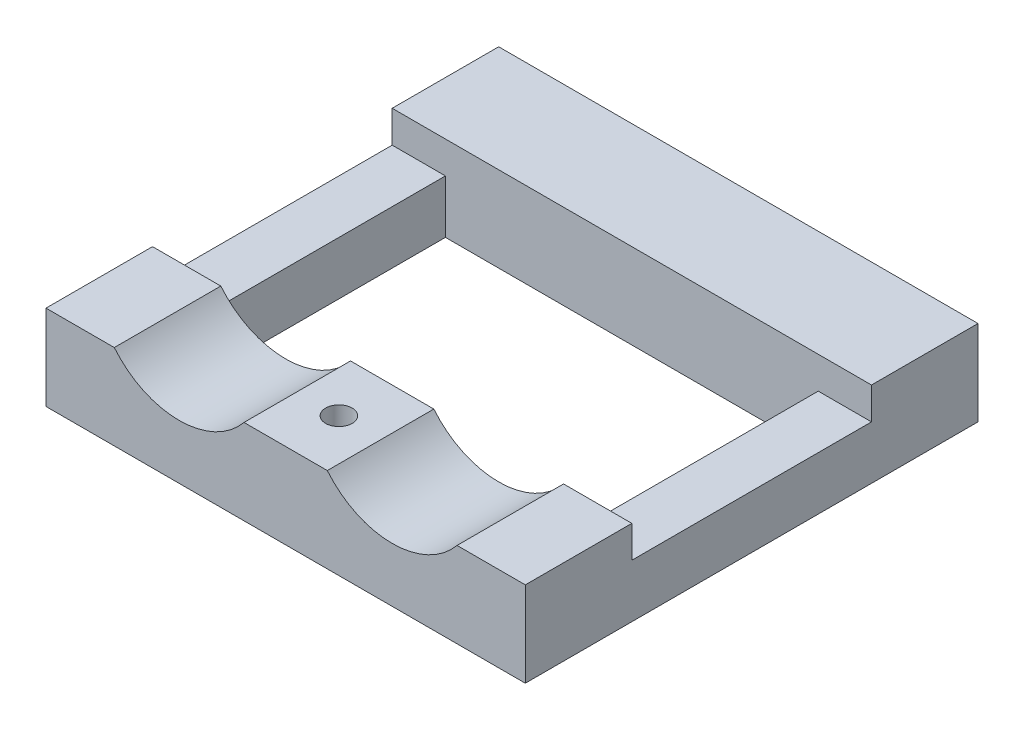
ISO-10303-21;
HEADER;
FILE_DESCRIPTION(('STEP AP214'),'2;1');
FILE_NAME('part.step','',(''),(''),'','','');
FILE_SCHEMA(('AUTOMOTIVE_DESIGN { 1 0 10303 214 1 1 1 1 }'));
ENDSEC;
DATA;
#1=APPLICATION_CONTEXT('core data for automotive mechanical design processes');
#2=APPLICATION_PROTOCOL_DEFINITION('international standard','automotive_design',2000,#1);
#3=PRODUCT_CONTEXT('',#1,'mechanical');
#4=PRODUCT('Part','Part','',(#3));
#5=PRODUCT_RELATED_PRODUCT_CATEGORY('part','',(#4));
#6=PRODUCT_DEFINITION_FORMATION('','',#4);
#7=PRODUCT_DEFINITION_CONTEXT('part definition',#1,'design');
#8=PRODUCT_DEFINITION('design','',#6,#7);
#9=PRODUCT_DEFINITION_SHAPE('','',#8);
#10=(LENGTH_UNIT() NAMED_UNIT(*) SI_UNIT(.MILLI.,.METRE.));
#11=(NAMED_UNIT(*) PLANE_ANGLE_UNIT() SI_UNIT($,.RADIAN.));
#12=(NAMED_UNIT(*) SI_UNIT($,.STERADIAN.) SOLID_ANGLE_UNIT());
#13=UNCERTAINTY_MEASURE_WITH_UNIT(LENGTH_MEASURE(1.E-05),#10,'distance_accuracy_value','');
#14=(GEOMETRIC_REPRESENTATION_CONTEXT(3) GLOBAL_UNCERTAINTY_ASSIGNED_CONTEXT((#13)) GLOBAL_UNIT_ASSIGNED_CONTEXT((#10,
#11,#12)) REPRESENTATION_CONTEXT('',''));
#15=CARTESIAN_POINT('',(0.,0.,0.));
#16=DIRECTION('',(0.,0.,1.));
#17=DIRECTION('',(1.,0.,0.));
#18=AXIS2_PLACEMENT_3D('',#15,#16,#17);
#19=CARTESIAN_POINT('',(0.,0.,0.));
#20=DIRECTION('',(0.,0.,-1.));
#21=DIRECTION('',(-1.,0.,0.));
#22=AXIS2_PLACEMENT_3D('',#19,#20,#21);
#23=PLANE('',#22);
#24=DIRECTION('',(0.,-1.,0.));
#25=VECTOR('',#24,1.);
#26=CARTESIAN_POINT('',(6.35,6.35,0.));
#27=LINE('',#26,#25);
#28=CARTESIAN_POINT('',(6.35,6.35,0.));
#29=VERTEX_POINT('',#28);
#30=CARTESIAN_POINT('',(6.35,0.,0.));
#31=VERTEX_POINT('',#30);
#32=EDGE_CURVE('E194',#29,#31,#27,.T.);
#33=ORIENTED_EDGE('',*,*,#32,.F.);
#34=DIRECTION('',(1.,0.,0.));
#35=VECTOR('',#34,1.);
#36=CARTESIAN_POINT('',(0.,6.35,0.));
#37=LINE('',#36,#35);
#38=CARTESIAN_POINT('',(0.,6.35,0.));
#39=VERTEX_POINT('',#38);
#40=EDGE_CURVE('E189',#39,#29,#37,.T.);
#41=ORIENTED_EDGE('',*,*,#40,.F.);
#42=DIRECTION('',(0.,-1.,0.));
#43=VECTOR('',#42,1.);
#44=CARTESIAN_POINT('',(0.,0.,0.));
#45=LINE('',#44,#43);
#46=CARTESIAN_POINT('',(0.,10.16,0.));
#47=VERTEX_POINT('',#46);
#48=EDGE_CURVE('E254',#47,#39,#45,.T.);
#49=ORIENTED_EDGE('',*,*,#48,.F.);
#50=DIRECTION('',(-1.,0.,0.));
#51=VECTOR('',#50,1.);
#52=CARTESIAN_POINT('',(0.,10.16,0.));
#53=LINE('',#52,#51);
#54=CARTESIAN_POINT('',(8.14166954023042,10.16,0.));
#55=VERTEX_POINT('',#54);
#56=EDGE_CURVE('E273',#55,#47,#53,.T.);
#57=ORIENTED_EDGE('',*,*,#56,.F.);
#58=CARTESIAN_POINT('',(15.875,16.5,0.));
#59=DIRECTION('',(0.,0.,1.));
#60=DIRECTION('',(1.,0.,0.));
#61=AXIS2_PLACEMENT_3D('',#58,#59,#60);
#62=CIRCLE('',#61,10.);
#63=CARTESIAN_POINT('',(23.6083304597696,10.16,0.));
#64=VERTEX_POINT('',#63);
#65=EDGE_CURVE('E243',#55,#64,#62,.T.);
#66=ORIENTED_EDGE('',*,*,#65,.T.);
#67=CARTESIAN_POINT('',(33.5416695402304,10.16,0.));
#68=VERTEX_POINT('',#67);
#69=EDGE_CURVE('E276',#68,#64,#53,.T.);
#70=ORIENTED_EDGE('',*,*,#69,.F.);
#71=CARTESIAN_POINT('',(41.275,16.5,0.));
#72=DIRECTION('',(0.,0.,1.));
#73=DIRECTION('',(1.,0.,0.));
#74=AXIS2_PLACEMENT_3D('',#71,#72,#73);
#75=CIRCLE('',#74,10.);
#76=CARTESIAN_POINT('',(49.0083304597696,10.16,0.));
#77=VERTEX_POINT('',#76);
#78=EDGE_CURVE('E232',#68,#77,#75,.T.);
#79=ORIENTED_EDGE('',*,*,#78,.T.);
#80=CARTESIAN_POINT('',(57.15,10.16,0.));
#81=VERTEX_POINT('',#80);
#82=EDGE_CURVE('E259',#81,#77,#53,.T.);
#83=ORIENTED_EDGE('',*,*,#82,.F.);
#84=DIRECTION('',(0.,1.,0.));
#85=VECTOR('',#84,1.);
#86=CARTESIAN_POINT('',(57.15,0.,0.));
#87=LINE('',#86,#85);
#88=CARTESIAN_POINT('',(57.15,6.35,0.));
#89=VERTEX_POINT('',#88);
#90=EDGE_CURVE('E271',#89,#81,#87,.T.);
#91=ORIENTED_EDGE('',*,*,#90,.F.);
#92=DIRECTION('',(1.,0.,0.));
#93=VECTOR('',#92,1.);
#94=CARTESIAN_POINT('',(57.15,6.35,0.));
#95=LINE('',#94,#93);
#96=CARTESIAN_POINT('',(50.8,6.35,0.));
#97=VERTEX_POINT('',#96);
#98=EDGE_CURVE('E209',#97,#89,#95,.T.);
#99=ORIENTED_EDGE('',*,*,#98,.F.);
#100=DIRECTION('',(0.,1.,0.));
#101=VECTOR('',#100,1.);
#102=CARTESIAN_POINT('',(50.8,6.35,0.));
#103=LINE('',#102,#101);
#104=CARTESIAN_POINT('',(50.8,0.,0.));
#105=VERTEX_POINT('',#104);
#106=EDGE_CURVE('E204',#105,#97,#103,.T.);
#107=ORIENTED_EDGE('',*,*,#106,.F.);
#108=DIRECTION('',(1.,0.,0.));
#109=VECTOR('',#108,1.);
#110=CARTESIAN_POINT('',(0.,0.,0.));
#111=LINE('',#110,#109);
#112=EDGE_CURVE('E58',#31,#105,#111,.T.);
#113=ORIENTED_EDGE('',*,*,#112,.F.);
#114=EDGE_LOOP('',(#33,#41,#49,#57,#66,#70,#79,#83,#91,#99,#107,#113));
#115=FACE_BOUND('',#114,.T.);
#116=ADVANCED_FACE('F35',(#115),#23,.T.);
#117=CARTESIAN_POINT('',(0.,10.16,12.7));
#118=DIRECTION('',(0.,-1.,0.));
#119=DIRECTION('',(0.,0.,-1.));
#120=AXIS2_PLACEMENT_3D('',#117,#118,#119);
#121=PLANE('',#120);
#122=ORIENTED_EDGE('',*,*,#82,.T.);
#123=DIRECTION('',(0.,0.,1.));
#124=VECTOR('',#123,1.);
#125=CARTESIAN_POINT('',(49.0083304597696,10.16,0.));
#126=LINE('',#125,#124);
#127=CARTESIAN_POINT('',(49.0083304597696,10.16,12.7));
#128=VERTEX_POINT('',#127);
#129=EDGE_CURVE('E239',#77,#128,#126,.T.);
#130=ORIENTED_EDGE('',*,*,#129,.T.);
#131=DIRECTION('',(-1.,0.,0.));
#132=VECTOR('',#131,1.);
#133=CARTESIAN_POINT('',(0.,10.16,12.7));
#134=LINE('',#133,#132);
#135=CARTESIAN_POINT('',(57.15,10.16,12.7));
#136=VERTEX_POINT('',#135);
#137=EDGE_CURVE('E263',#136,#128,#134,.T.);
#138=ORIENTED_EDGE('',*,*,#137,.F.);
#139=DIRECTION('',(0.,0.,-1.));
#140=VECTOR('',#139,1.);
#141=CARTESIAN_POINT('',(57.15,10.16,12.7));
#142=LINE('',#141,#140);
#143=EDGE_CURVE('E157',#136,#81,#142,.T.);
#144=ORIENTED_EDGE('',*,*,#143,.T.);
#145=EDGE_LOOP('',(#122,#130,#138,#144));
#146=FACE_BOUND('',#145,.T.);
#147=ADVANCED_FACE('F283',(#146),#121,.F.);
#148=CARTESIAN_POINT('',(28.575,10.16,6.35));
#149=DIRECTION('',(0.,1.,0.));
#150=DIRECTION('',(0.,0.,1.));
#151=AXIS2_PLACEMENT_3D('',#148,#149,#150);
#152=CIRCLE('',#151,1.5875);
#153=CARTESIAN_POINT('',(28.575,10.16,7.9375));
#154=VERTEX_POINT('',#153);
#155=EDGE_CURVE('E225',#154,#154,#152,.T.);
#156=ORIENTED_EDGE('',*,*,#155,.F.);
#157=EDGE_LOOP('',(#156));
#158=FACE_BOUND('',#157,.T.);
#159=CARTESIAN_POINT('',(33.5416695402304,10.16,12.7));
#160=VERTEX_POINT('',#159);
#161=CARTESIAN_POINT('',(23.6083304597696,10.16,12.7));
#162=VERTEX_POINT('',#161);
#163=EDGE_CURVE('E267',#160,#162,#134,.T.);
#164=ORIENTED_EDGE('',*,*,#163,.F.);
#165=DIRECTION('',(0.,0.,1.));
#166=VECTOR('',#165,1.);
#167=CARTESIAN_POINT('',(33.5416695402304,10.16,0.));
#168=LINE('',#167,#166);
#169=EDGE_CURVE('E235',#160,#68,#168,.F.);
#170=ORIENTED_EDGE('',*,*,#169,.T.);
#171=ORIENTED_EDGE('',*,*,#69,.T.);
#172=DIRECTION('',(0.,0.,1.));
#173=VECTOR('',#172,1.);
#174=CARTESIAN_POINT('',(23.6083304597696,10.16,0.));
#175=LINE('',#174,#173);
#176=EDGE_CURVE('E251',#64,#162,#175,.T.);
#177=ORIENTED_EDGE('',*,*,#176,.T.);
#178=EDGE_LOOP('',(#164,#170,#171,#177));
#179=FACE_BOUND('',#178,.T.);
#180=ADVANCED_FACE('F292',(#158,#179),#121,.F.);
#181=CARTESIAN_POINT('',(0.,0.,12.7));
#182=DIRECTION('',(1.,0.,0.));
#183=DIRECTION('',(0.,0.,-1.));
#184=AXIS2_PLACEMENT_3D('',#181,#182,#183);
#185=PLANE('',#184);
#186=ORIENTED_EDGE('',*,*,#48,.T.);
#187=DIRECTION('',(0.,0.,1.));
#188=VECTOR('',#187,1.);
#189=CARTESIAN_POINT('',(0.,6.35,-28.575));
#190=LINE('',#189,#188);
#191=CARTESIAN_POINT('',(0.,6.35,-28.575));
#192=VERTEX_POINT('',#191);
#193=EDGE_CURVE('E202',#192,#39,#190,.T.);
#194=ORIENTED_EDGE('',*,*,#193,.F.);
#195=DIRECTION('',(0.,1.,0.));
#196=VECTOR('',#195,1.);
#197=CARTESIAN_POINT('',(0.,0.,-28.575));
#198=LINE('',#197,#196);
#199=CARTESIAN_POINT('',(0.,10.16,-28.575));
#200=VERTEX_POINT('',#199);
#201=EDGE_CURVE('E172',#192,#200,#198,.T.);
#202=ORIENTED_EDGE('',*,*,#201,.T.);
#203=DIRECTION('',(0.,0.,1.));
#204=VECTOR('',#203,1.);
#205=CARTESIAN_POINT('',(0.,10.16,-41.275));
#206=LINE('',#205,#204);
#207=CARTESIAN_POINT('',(0.,10.16,-41.275));
#208=VERTEX_POINT('',#207);
#209=EDGE_CURVE('E186',#208,#200,#206,.T.);
#210=ORIENTED_EDGE('',*,*,#209,.F.);
#211=DIRECTION('',(0.,1.,0.));
#212=VECTOR('',#211,1.);
#213=CARTESIAN_POINT('',(0.,0.,-41.275));
#214=LINE('',#213,#212);
#215=CARTESIAN_POINT('',(0.,0.,-41.275));
#216=VERTEX_POINT('',#215);
#217=EDGE_CURVE('E164',#216,#208,#214,.T.);
#218=ORIENTED_EDGE('',*,*,#217,.F.);
#219=DIRECTION('',(0.,0.,-1.));
#220=VECTOR('',#219,1.);
#221=CARTESIAN_POINT('',(0.,0.,12.7));
#222=LINE('',#221,#220);
#223=CARTESIAN_POINT('',(0.,0.,12.7));
#224=VERTEX_POINT('',#223);
#225=EDGE_CURVE('E11',#224,#216,#222,.T.);
#226=ORIENTED_EDGE('',*,*,#225,.F.);
#227=DIRECTION('',(0.,-1.,0.));
#228=VECTOR('',#227,1.);
#229=CARTESIAN_POINT('',(0.,0.,12.7));
#230=LINE('',#229,#228);
#231=CARTESIAN_POINT('',(0.,10.16,12.7));
#232=VERTEX_POINT('',#231);
#233=EDGE_CURVE('E255',#232,#224,#230,.T.);
#234=ORIENTED_EDGE('',*,*,#233,.F.);
#235=DIRECTION('',(0.,0.,-1.));
#236=VECTOR('',#235,1.);
#237=CARTESIAN_POINT('',(0.,10.16,12.7));
#238=LINE('',#237,#236);
#239=EDGE_CURVE('E266',#232,#47,#238,.T.);
#240=ORIENTED_EDGE('',*,*,#239,.T.);
#241=EDGE_LOOP('',(#186,#194,#202,#210,#218,#226,#234,#240));
#242=FACE_BOUND('',#241,.T.);
#243=ADVANCED_FACE('F37',(#242),#185,.F.);
#244=CARTESIAN_POINT('',(0.,0.,12.7));
#245=DIRECTION('',(0.,1.,0.));
#246=DIRECTION('',(0.,0.,1.));
#247=AXIS2_PLACEMENT_3D('',#244,#245,#246);
#248=PLANE('',#247);
#249=DIRECTION('',(0.,0.,1.));
#250=VECTOR('',#249,1.);
#251=CARTESIAN_POINT('',(50.8,0.,-28.575));
#252=LINE('',#251,#250);
#253=CARTESIAN_POINT('',(50.8,0.,-28.575));
#254=VERTEX_POINT('',#253);
#255=EDGE_CURVE('E222',#254,#105,#252,.T.);
#256=ORIENTED_EDGE('',*,*,#255,.F.);
#257=DIRECTION('',(-1.,0.,0.));
#258=VECTOR('',#257,1.);
#259=CARTESIAN_POINT('',(57.15,0.,-28.575));
#260=LINE('',#259,#258);
#261=CARTESIAN_POINT('',(6.35,0.,-28.575));
#262=VERTEX_POINT('',#261);
#263=EDGE_CURVE('E181',#254,#262,#260,.T.);
#264=ORIENTED_EDGE('',*,*,#263,.T.);
#265=DIRECTION('',(0.,0.,1.));
#266=VECTOR('',#265,1.);
#267=CARTESIAN_POINT('',(6.35,0.,-28.575));
#268=LINE('',#267,#266);
#269=EDGE_CURVE('E197',#262,#31,#268,.T.);
#270=ORIENTED_EDGE('',*,*,#269,.T.);
#271=ORIENTED_EDGE('',*,*,#112,.T.);
#272=EDGE_LOOP('',(#256,#264,#270,#271));
#273=FACE_BOUND('',#272,.T.);
#274=CARTESIAN_POINT('',(28.575,0.,6.35));
#275=DIRECTION('',(0.,1.,0.));
#276=DIRECTION('',(0.,0.,1.));
#277=AXIS2_PLACEMENT_3D('',#274,#275,#276);
#278=CIRCLE('',#277,1.5875);
#279=CARTESIAN_POINT('',(28.575,0.,7.9375));
#280=VERTEX_POINT('',#279);
#281=EDGE_CURVE('E226',#280,#280,#278,.T.);
#282=ORIENTED_EDGE('',*,*,#281,.T.);
#283=EDGE_LOOP('',(#282));
#284=FACE_BOUND('',#283,.T.);
#285=ORIENTED_EDGE('',*,*,#225,.T.);
#286=DIRECTION('',(-1.,0.,0.));
#287=VECTOR('',#286,1.);
#288=CARTESIAN_POINT('',(57.15,0.,-41.275));
#289=LINE('',#288,#287);
#290=CARTESIAN_POINT('',(57.15,0.,-41.275));
#291=VERTEX_POINT('',#290);
#292=EDGE_CURVE('E159',#291,#216,#289,.T.);
#293=ORIENTED_EDGE('',*,*,#292,.F.);
#294=DIRECTION('',(0.,0.,-1.));
#295=VECTOR('',#294,1.);
#296=CARTESIAN_POINT('',(57.15,0.,12.7));
#297=LINE('',#296,#295);
#298=CARTESIAN_POINT('',(57.15,0.,12.7));
#299=VERTEX_POINT('',#298);
#300=EDGE_CURVE('E43',#299,#291,#297,.T.);
#301=ORIENTED_EDGE('',*,*,#300,.F.);
#302=DIRECTION('',(1.,0.,0.));
#303=VECTOR('',#302,1.);
#304=CARTESIAN_POINT('',(0.,0.,12.7));
#305=LINE('',#304,#303);
#306=EDGE_CURVE('E258',#224,#299,#305,.T.);
#307=ORIENTED_EDGE('',*,*,#306,.F.);
#308=EDGE_LOOP('',(#285,#293,#301,#307));
#309=FACE_BOUND('',#308,.T.);
#310=ADVANCED_FACE('F160',(#273,#284,#309),#248,.F.);
#311=CARTESIAN_POINT('',(57.15,0.,12.7));
#312=DIRECTION('',(-1.,0.,0.));
#313=DIRECTION('',(0.,0.,1.));
#314=AXIS2_PLACEMENT_3D('',#311,#312,#313);
#315=PLANE('',#314);
#316=ORIENTED_EDGE('',*,*,#300,.T.);
#317=DIRECTION('',(0.,-1.,0.));
#318=VECTOR('',#317,1.);
#319=CARTESIAN_POINT('',(57.15,0.,-41.275));
#320=LINE('',#319,#318);
#321=CARTESIAN_POINT('',(57.15,10.16,-41.275));
#322=VERTEX_POINT('',#321);
#323=EDGE_CURVE('E153',#322,#291,#320,.T.);
#324=ORIENTED_EDGE('',*,*,#323,.F.);
#325=DIRECTION('',(0.,0.,1.));
#326=VECTOR('',#325,1.);
#327=CARTESIAN_POINT('',(57.15,10.16,-41.275));
#328=LINE('',#327,#326);
#329=CARTESIAN_POINT('',(57.15,10.16,-28.575));
#330=VERTEX_POINT('',#329);
#331=EDGE_CURVE('E177',#322,#330,#328,.T.);
#332=ORIENTED_EDGE('',*,*,#331,.T.);
#333=DIRECTION('',(0.,-1.,0.));
#334=VECTOR('',#333,1.);
#335=CARTESIAN_POINT('',(57.15,0.,-28.575));
#336=LINE('',#335,#334);
#337=CARTESIAN_POINT('',(57.15,6.35,-28.575));
#338=VERTEX_POINT('',#337);
#339=EDGE_CURVE('E178',#330,#338,#336,.T.);
#340=ORIENTED_EDGE('',*,*,#339,.T.);
#341=DIRECTION('',(0.,0.,1.));
#342=VECTOR('',#341,1.);
#343=CARTESIAN_POINT('',(57.15,6.35,-28.575));
#344=LINE('',#343,#342);
#345=EDGE_CURVE('E212',#338,#89,#344,.T.);
#346=ORIENTED_EDGE('',*,*,#345,.T.);
#347=ORIENTED_EDGE('',*,*,#90,.T.);
#348=ORIENTED_EDGE('',*,*,#143,.F.);
#349=DIRECTION('',(0.,1.,0.));
#350=VECTOR('',#349,1.);
#351=CARTESIAN_POINT('',(57.15,0.,12.7));
#352=LINE('',#351,#350);
#353=EDGE_CURVE('E155',#299,#136,#352,.T.);
#354=ORIENTED_EDGE('',*,*,#353,.F.);
#355=EDGE_LOOP('',(#316,#324,#332,#340,#346,#347,#348,#354));
#356=FACE_BOUND('',#355,.T.);
#357=ADVANCED_FACE('F150',(#356),#315,.F.);
#358=CARTESIAN_POINT('',(8.14166954023042,10.16,12.7));
#359=VERTEX_POINT('',#358);
#360=EDGE_CURVE('E262',#359,#232,#134,.T.);
#361=ORIENTED_EDGE('',*,*,#360,.F.);
#362=DIRECTION('',(0.,0.,1.));
#363=VECTOR('',#362,1.);
#364=CARTESIAN_POINT('',(8.14166954023042,10.16,0.));
#365=LINE('',#364,#363);
#366=EDGE_CURVE('E246',#359,#55,#365,.F.);
#367=ORIENTED_EDGE('',*,*,#366,.T.);
#368=ORIENTED_EDGE('',*,*,#56,.T.);
#369=ORIENTED_EDGE('',*,*,#239,.F.);
#370=EDGE_LOOP('',(#361,#367,#368,#369));
#371=FACE_BOUND('',#370,.T.);
#372=ADVANCED_FACE('F301',(#371),#121,.F.);
#373=CARTESIAN_POINT('',(0.,0.,12.7));
#374=DIRECTION('',(0.,0.,-1.));
#375=DIRECTION('',(-1.,0.,0.));
#376=AXIS2_PLACEMENT_3D('',#373,#374,#375);
#377=PLANE('',#376);
#378=ORIENTED_EDGE('',*,*,#137,.T.);
#379=CARTESIAN_POINT('',(41.275,16.5,12.7));
#380=DIRECTION('',(0.,0.,1.));
#381=DIRECTION('',(1.,0.,0.));
#382=AXIS2_PLACEMENT_3D('',#379,#380,#381);
#383=CIRCLE('',#382,10.);
#384=EDGE_CURVE('E229',#160,#128,#383,.T.);
#385=ORIENTED_EDGE('',*,*,#384,.F.);
#386=ORIENTED_EDGE('',*,*,#163,.T.);
#387=CARTESIAN_POINT('',(15.875,16.5,12.7));
#388=DIRECTION('',(0.,0.,1.));
#389=DIRECTION('',(1.,0.,0.));
#390=AXIS2_PLACEMENT_3D('',#387,#388,#389);
#391=CIRCLE('',#390,10.);
#392=EDGE_CURVE('E242',#359,#162,#391,.T.);
#393=ORIENTED_EDGE('',*,*,#392,.F.);
#394=ORIENTED_EDGE('',*,*,#360,.T.);
#395=ORIENTED_EDGE('',*,*,#233,.T.);
#396=ORIENTED_EDGE('',*,*,#306,.T.);
#397=ORIENTED_EDGE('',*,*,#353,.T.);
#398=EDGE_LOOP('',(#378,#385,#386,#393,#394,#395,#396,#397));
#399=FACE_BOUND('',#398,.T.);
#400=ADVANCED_FACE('F298',(#399),#377,.F.);
#401=CARTESIAN_POINT('',(15.875,16.5,0.));
#402=DIRECTION('',(0.,0.,1.));
#403=DIRECTION('',(1.,0.,0.));
#404=AXIS2_PLACEMENT_3D('',#401,#402,#403);
#405=CYLINDRICAL_SURFACE('',#404,10.);
#406=ORIENTED_EDGE('',*,*,#65,.F.);
#407=ORIENTED_EDGE('',*,*,#366,.F.);
#408=ORIENTED_EDGE('',*,*,#392,.T.);
#409=ORIENTED_EDGE('',*,*,#176,.F.);
#410=EDGE_LOOP('',(#406,#407,#408,#409));
#411=FACE_BOUND('',#410,.T.);
#412=ADVANCED_FACE('F366',(#411),#405,.F.);
#413=CARTESIAN_POINT('',(41.275,16.5,0.));
#414=DIRECTION('',(0.,0.,1.));
#415=DIRECTION('',(1.,0.,0.));
#416=AXIS2_PLACEMENT_3D('',#413,#414,#415);
#417=CYLINDRICAL_SURFACE('',#416,10.);
#418=ORIENTED_EDGE('',*,*,#78,.F.);
#419=ORIENTED_EDGE('',*,*,#169,.F.);
#420=ORIENTED_EDGE('',*,*,#384,.T.);
#421=ORIENTED_EDGE('',*,*,#129,.F.);
#422=EDGE_LOOP('',(#418,#419,#420,#421));
#423=FACE_BOUND('',#422,.T.);
#424=ADVANCED_FACE('F288',(#423),#417,.F.);
#425=CARTESIAN_POINT('',(28.575,0.,6.35));
#426=DIRECTION('',(0.,1.,0.));
#427=DIRECTION('',(0.,0.,1.));
#428=AXIS2_PLACEMENT_3D('',#425,#426,#427);
#429=CYLINDRICAL_SURFACE('',#428,1.5875);
#430=ORIENTED_EDGE('',*,*,#281,.F.);
#431=EDGE_LOOP('',(#430));
#432=FACE_BOUND('',#431,.T.);
#433=ORIENTED_EDGE('',*,*,#155,.T.);
#434=EDGE_LOOP('',(#433));
#435=FACE_BOUND('',#434,.T.);
#436=ADVANCED_FACE('F357',(#432,#435),#429,.F.);
#437=CARTESIAN_POINT('',(50.8,6.35,-28.575));
#438=DIRECTION('',(1.,0.,0.));
#439=DIRECTION('',(0.,0.,-1.));
#440=AXIS2_PLACEMENT_3D('',#437,#438,#439);
#441=PLANE('',#440);
#442=ORIENTED_EDGE('',*,*,#106,.T.);
#443=DIRECTION('',(0.,0.,1.));
#444=VECTOR('',#443,1.);
#445=CARTESIAN_POINT('',(50.8,6.35,-28.575));
#446=LINE('',#445,#444);
#447=CARTESIAN_POINT('',(50.8,6.35,-28.575));
#448=VERTEX_POINT('',#447);
#449=EDGE_CURVE('E219',#448,#97,#446,.T.);
#450=ORIENTED_EDGE('',*,*,#449,.F.);
#451=DIRECTION('',(0.,1.,0.));
#452=VECTOR('',#451,1.);
#453=CARTESIAN_POINT('',(50.8,6.35,-28.575));
#454=LINE('',#453,#452);
#455=EDGE_CURVE('E205',#254,#448,#454,.T.);
#456=ORIENTED_EDGE('',*,*,#455,.F.);
#457=ORIENTED_EDGE('',*,*,#255,.T.);
#458=EDGE_LOOP('',(#442,#450,#456,#457));
#459=FACE_BOUND('',#458,.T.);
#460=ADVANCED_FACE('F320',(#459),#441,.F.);
#461=CARTESIAN_POINT('',(57.15,6.35,-28.575));
#462=DIRECTION('',(0.,-1.,0.));
#463=DIRECTION('',(0.,0.,-1.));
#464=AXIS2_PLACEMENT_3D('',#461,#462,#463);
#465=PLANE('',#464);
#466=ORIENTED_EDGE('',*,*,#98,.T.);
#467=ORIENTED_EDGE('',*,*,#345,.F.);
#468=DIRECTION('',(1.,0.,0.));
#469=VECTOR('',#468,1.);
#470=CARTESIAN_POINT('',(57.15,6.35,-28.575));
#471=LINE('',#470,#469);
#472=EDGE_CURVE('E208',#448,#338,#471,.T.);
#473=ORIENTED_EDGE('',*,*,#472,.F.);
#474=ORIENTED_EDGE('',*,*,#449,.T.);
#475=EDGE_LOOP('',(#466,#467,#473,#474));
#476=FACE_BOUND('',#475,.T.);
#477=ADVANCED_FACE('F318',(#476),#465,.F.);
#478=CARTESIAN_POINT('',(0.,6.35,-28.575));
#479=DIRECTION('',(0.,-1.,0.));
#480=DIRECTION('',(1.,0.,0.));
#481=AXIS2_PLACEMENT_3D('',#478,#479,#480);
#482=PLANE('',#481);
#483=ORIENTED_EDGE('',*,*,#40,.T.);
#484=DIRECTION('',(0.,0.,1.));
#485=VECTOR('',#484,1.);
#486=CARTESIAN_POINT('',(6.35,6.35,-28.575));
#487=LINE('',#486,#485);
#488=CARTESIAN_POINT('',(6.35,6.35,-28.575));
#489=VERTEX_POINT('',#488);
#490=EDGE_CURVE('E50',#489,#29,#487,.T.);
#491=ORIENTED_EDGE('',*,*,#490,.F.);
#492=DIRECTION('',(1.,0.,0.));
#493=VECTOR('',#492,1.);
#494=CARTESIAN_POINT('',(0.,6.35,-28.575));
#495=LINE('',#494,#493);
#496=EDGE_CURVE('E190',#192,#489,#495,.T.);
#497=ORIENTED_EDGE('',*,*,#496,.F.);
#498=ORIENTED_EDGE('',*,*,#193,.T.);
#499=EDGE_LOOP('',(#483,#491,#497,#498));
#500=FACE_BOUND('',#499,.T.);
#501=ADVANCED_FACE('F325',(#500),#482,.F.);
#502=CARTESIAN_POINT('',(6.35,6.35,-28.575));
#503=DIRECTION('',(-1.,0.,0.));
#504=DIRECTION('',(0.,0.,1.));
#505=AXIS2_PLACEMENT_3D('',#502,#503,#504);
#506=PLANE('',#505);
#507=ORIENTED_EDGE('',*,*,#32,.T.);
#508=ORIENTED_EDGE('',*,*,#269,.F.);
#509=DIRECTION('',(0.,-1.,0.));
#510=VECTOR('',#509,1.);
#511=CARTESIAN_POINT('',(6.35,6.35,-28.575));
#512=LINE('',#511,#510);
#513=EDGE_CURVE('E193',#489,#262,#512,.T.);
#514=ORIENTED_EDGE('',*,*,#513,.F.);
#515=ORIENTED_EDGE('',*,*,#490,.T.);
#516=EDGE_LOOP('',(#507,#508,#514,#515));
#517=FACE_BOUND('',#516,.T.);
#518=ADVANCED_FACE('F322',(#517),#506,.F.);
#519=CARTESIAN_POINT('',(0.,0.,-28.575));
#520=DIRECTION('',(0.,0.,1.));
#521=DIRECTION('',(1.,0.,0.));
#522=AXIS2_PLACEMENT_3D('',#519,#520,#521);
#523=PLANE('',#522);
#524=ORIENTED_EDGE('',*,*,#455,.T.);
#525=ORIENTED_EDGE('',*,*,#472,.T.);
#526=ORIENTED_EDGE('',*,*,#339,.F.);
#527=DIRECTION('',(1.,0.,0.));
#528=VECTOR('',#527,1.);
#529=CARTESIAN_POINT('',(57.15,10.16,-28.575));
#530=LINE('',#529,#528);
#531=EDGE_CURVE('E170',#200,#330,#530,.T.);
#532=ORIENTED_EDGE('',*,*,#531,.F.);
#533=ORIENTED_EDGE('',*,*,#201,.F.);
#534=ORIENTED_EDGE('',*,*,#496,.T.);
#535=ORIENTED_EDGE('',*,*,#513,.T.);
#536=ORIENTED_EDGE('',*,*,#263,.F.);
#537=EDGE_LOOP('',(#524,#525,#526,#532,#533,#534,#535,#536));
#538=FACE_BOUND('',#537,.T.);
#539=ADVANCED_FACE('F313',(#538),#523,.T.);
#540=CARTESIAN_POINT('',(57.15,10.16,-41.275));
#541=DIRECTION('',(0.,-1.,0.));
#542=DIRECTION('',(0.,0.,-1.));
#543=AXIS2_PLACEMENT_3D('',#540,#541,#542);
#544=PLANE('',#543);
#545=ORIENTED_EDGE('',*,*,#531,.T.);
#546=ORIENTED_EDGE('',*,*,#331,.F.);
#547=DIRECTION('',(1.,0.,0.));
#548=VECTOR('',#547,1.);
#549=CARTESIAN_POINT('',(57.15,10.16,-41.275));
#550=LINE('',#549,#548);
#551=EDGE_CURVE('E168',#208,#322,#550,.T.);
#552=ORIENTED_EDGE('',*,*,#551,.F.);
#553=ORIENTED_EDGE('',*,*,#209,.T.);
#554=EDGE_LOOP('',(#545,#546,#552,#553));
#555=FACE_BOUND('',#554,.T.);
#556=ADVANCED_FACE('F310',(#555),#544,.F.);
#557=CARTESIAN_POINT('',(0.,0.,-41.275));
#558=DIRECTION('',(0.,0.,1.));
#559=DIRECTION('',(1.,0.,0.));
#560=AXIS2_PLACEMENT_3D('',#557,#558,#559);
#561=PLANE('',#560);
#562=ORIENTED_EDGE('',*,*,#323,.T.);
#563=ORIENTED_EDGE('',*,*,#292,.T.);
#564=ORIENTED_EDGE('',*,*,#217,.T.);
#565=ORIENTED_EDGE('',*,*,#551,.T.);
#566=EDGE_LOOP('',(#562,#563,#564,#565));
#567=FACE_BOUND('',#566,.T.);
#568=ADVANCED_FACE('F166',(#567),#561,.F.);
#569=CLOSED_SHELL('',(#116,#147,#180,#243,#310,#357,#372,#400,#412,#424,#436,#460,#477,#501,
#518,#539,#556,#568));
#570=MANIFOLD_SOLID_BREP('B2',#569);
#571=ADVANCED_BREP_SHAPE_REPRESENTATION('',(#18,#570),#14);
#572=SHAPE_DEFINITION_REPRESENTATION(#9,#571);
ENDSEC;
END-ISO-10303-21;
